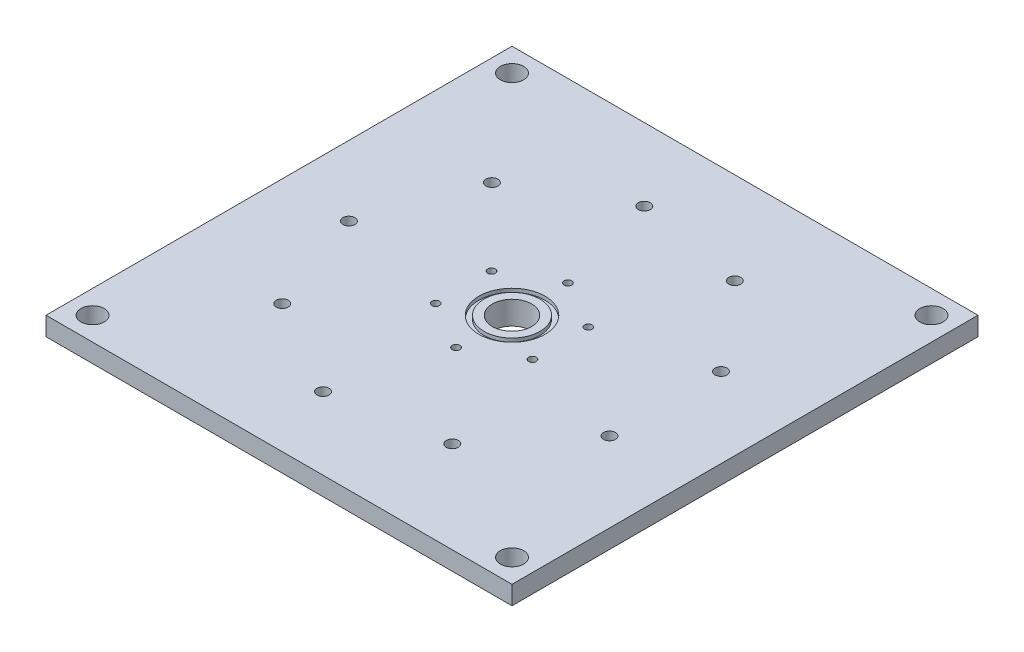
ISO-10303-21;
HEADER;
FILE_DESCRIPTION(('STEP AP214'),'2;1');
FILE_NAME('part.step','',(''),(''),'','','');
FILE_SCHEMA(('AUTOMOTIVE_DESIGN { 1 0 10303 214 1 1 1 1 }'));
ENDSEC;
DATA;
#1=APPLICATION_CONTEXT('core data for automotive mechanical design processes');
#2=APPLICATION_PROTOCOL_DEFINITION('international standard','automotive_design',2000,#1);
#3=PRODUCT_CONTEXT('',#1,'mechanical');
#4=PRODUCT('Part','Part','',(#3));
#5=PRODUCT_RELATED_PRODUCT_CATEGORY('part','',(#4));
#6=PRODUCT_DEFINITION_FORMATION('','',#4);
#7=PRODUCT_DEFINITION_CONTEXT('part definition',#1,'design');
#8=PRODUCT_DEFINITION('design','',#6,#7);
#9=PRODUCT_DEFINITION_SHAPE('','',#8);
#10=(LENGTH_UNIT() NAMED_UNIT(*) SI_UNIT(.MILLI.,.METRE.));
#11=(NAMED_UNIT(*) PLANE_ANGLE_UNIT() SI_UNIT($,.RADIAN.));
#12=(NAMED_UNIT(*) SI_UNIT($,.STERADIAN.) SOLID_ANGLE_UNIT());
#13=UNCERTAINTY_MEASURE_WITH_UNIT(LENGTH_MEASURE(1.E-05),#10,'distance_accuracy_value','');
#14=(GEOMETRIC_REPRESENTATION_CONTEXT(3) GLOBAL_UNCERTAINTY_ASSIGNED_CONTEXT((#13)) GLOBAL_UNIT_ASSIGNED_CONTEXT((#10,
#11,#12)) REPRESENTATION_CONTEXT('',''));
#15=CARTESIAN_POINT('',(0.,0.,0.));
#16=DIRECTION('',(0.,0.,1.));
#17=DIRECTION('',(1.,0.,0.));
#18=AXIS2_PLACEMENT_3D('',#15,#16,#17);
#19=CARTESIAN_POINT('',(0.,0.,0.));
#20=DIRECTION('',(0.,-1.,0.));
#21=DIRECTION('',(0.,0.,-1.));
#22=AXIS2_PLACEMENT_3D('',#19,#20,#21);
#23=PLANE('',#22);
#24=DIRECTION('',(0.,0.,-1.));
#25=VECTOR('',#24,1.);
#26=CARTESIAN_POINT('',(63.5,0.,63.5));
#27=LINE('',#26,#25);
#28=CARTESIAN_POINT('',(63.5,0.,63.5));
#29=VERTEX_POINT('',#28);
#30=CARTESIAN_POINT('',(63.5,0.,-63.5));
#31=VERTEX_POINT('',#30);
#32=EDGE_CURVE('E108',#29,#31,#27,.T.);
#33=ORIENTED_EDGE('',*,*,#32,.F.);
#34=DIRECTION('',(1.,0.,0.));
#35=VECTOR('',#34,1.);
#36=CARTESIAN_POINT('',(-63.5,0.,63.5));
#37=LINE('',#36,#35);
#38=CARTESIAN_POINT('',(-63.5,0.,63.5));
#39=VERTEX_POINT('',#38);
#40=EDGE_CURVE('E84',#39,#29,#37,.T.);
#41=ORIENTED_EDGE('',*,*,#40,.F.);
#42=DIRECTION('',(0.,0.,1.));
#43=VECTOR('',#42,1.);
#44=CARTESIAN_POINT('',(-63.5,0.,63.5));
#45=LINE('',#44,#43);
#46=CARTESIAN_POINT('',(-63.5,0.,-63.5));
#47=VERTEX_POINT('',#46);
#48=EDGE_CURVE('E78',#47,#39,#45,.T.);
#49=ORIENTED_EDGE('',*,*,#48,.F.);
#50=DIRECTION('',(-1.,0.,0.));
#51=VECTOR('',#50,1.);
#52=CARTESIAN_POINT('',(-63.5,0.,-63.5));
#53=LINE('',#52,#51);
#54=EDGE_CURVE('E100',#31,#47,#53,.T.);
#55=ORIENTED_EDGE('',*,*,#54,.F.);
#56=EDGE_LOOP('',(#33,#41,#49,#55));
#57=FACE_BOUND('',#56,.T.);
#58=CARTESIAN_POINT('',(22.225,0.,38.4948291982183));
#59=DIRECTION('',(0.,-1.,0.));
#60=DIRECTION('',(0.,0.,-1.));
#61=AXIS2_PLACEMENT_3D('',#58,#59,#60);
#62=CIRCLE('',#61,1.63195);
#63=CARTESIAN_POINT('',(22.225,0.,36.8628791982183));
#64=VERTEX_POINT('',#63);
#65=EDGE_CURVE('E173',#64,#64,#62,.F.);
#66=ORIENTED_EDGE('',*,*,#65,.T.);
#67=EDGE_LOOP('',(#66));
#68=FACE_BOUND('',#67,.T.);
#69=CARTESIAN_POINT('',(41.7693369939337,0.,15.2027953708259));
#70=DIRECTION('',(0.,-1.,0.));
#71=DIRECTION('',(0.,0.,-1.));
#72=AXIS2_PLACEMENT_3D('',#69,#70,#71);
#73=CIRCLE('',#72,1.63195);
#74=CARTESIAN_POINT('',(41.7693369939337,0.,13.5708453708259));
#75=VERTEX_POINT('',#74);
#76=EDGE_CURVE('E179',#75,#75,#73,.F.);
#77=ORIENTED_EDGE('',*,*,#76,.T.);
#78=EDGE_LOOP('',(#77));
#79=FACE_BOUND('',#78,.T.);
#80=CARTESIAN_POINT('',(41.7693369939336,0.,-15.2027953708261));
#81=DIRECTION('',(0.,-1.,0.));
#82=DIRECTION('',(0.,0.,-1.));
#83=AXIS2_PLACEMENT_3D('',#80,#81,#82);
#84=CIRCLE('',#83,1.63195);
#85=CARTESIAN_POINT('',(41.7693369939336,0.,-16.8347453708261));
#86=VERTEX_POINT('',#85);
#87=EDGE_CURVE('E185',#86,#86,#84,.F.);
#88=ORIENTED_EDGE('',*,*,#87,.T.);
#89=EDGE_LOOP('',(#88));
#90=FACE_BOUND('',#89,.T.);
#91=CARTESIAN_POINT('',(22.2249999999998,0.,-38.4948291982184));
#92=DIRECTION('',(0.,-1.,0.));
#93=DIRECTION('',(0.,0.,-1.));
#94=AXIS2_PLACEMENT_3D('',#91,#92,#93);
#95=CIRCLE('',#94,1.63195);
#96=CARTESIAN_POINT('',(22.2249999999998,0.,-40.1267791982184));
#97=VERTEX_POINT('',#96);
#98=EDGE_CURVE('E191',#97,#97,#95,.F.);
#99=ORIENTED_EDGE('',*,*,#98,.T.);
#100=EDGE_LOOP('',(#99));
#101=FACE_BOUND('',#100,.T.);
#102=CARTESIAN_POINT('',(-7.71866149729532,0.,-43.7747046213926));
#103=DIRECTION('',(0.,-1.,0.));
#104=DIRECTION('',(0.,0.,-1.));
#105=AXIS2_PLACEMENT_3D('',#102,#103,#104);
#106=CIRCLE('',#105,1.63195);
#107=CARTESIAN_POINT('',(-7.71866149729532,0.,-45.4066546213926));
#108=VERTEX_POINT('',#107);
#109=EDGE_CURVE('E197',#108,#108,#106,.F.);
#110=ORIENTED_EDGE('',*,*,#109,.T.);
#111=EDGE_LOOP('',(#110));
#112=FACE_BOUND('',#111,.T.);
#113=CARTESIAN_POINT('',(-34.0506754966388,0.,-28.5719092505664));
#114=DIRECTION('',(0.,-1.,0.));
#115=DIRECTION('',(0.,0.,-1.));
#116=AXIS2_PLACEMENT_3D('',#113,#114,#115);
#117=CIRCLE('',#116,1.63195);
#118=CARTESIAN_POINT('',(-34.0506754966388,0.,-30.2038592505664));
#119=VERTEX_POINT('',#118);
#120=EDGE_CURVE('E203',#119,#119,#117,.F.);
#121=ORIENTED_EDGE('',*,*,#120,.T.);
#122=EDGE_LOOP('',(#121));
#123=FACE_BOUND('',#122,.T.);
#124=CARTESIAN_POINT('',(-44.45,0.,4.1286418728248E-13));
#125=DIRECTION('',(0.,-1.,0.));
#126=DIRECTION('',(0.,0.,-1.));
#127=AXIS2_PLACEMENT_3D('',#124,#125,#126);
#128=CIRCLE('',#127,1.63195);
#129=CARTESIAN_POINT('',(-44.45,0.,-1.63194999999959));
#130=VERTEX_POINT('',#129);
#131=EDGE_CURVE('E209',#130,#130,#128,.F.);
#132=ORIENTED_EDGE('',*,*,#131,.T.);
#133=EDGE_LOOP('',(#132));
#134=FACE_BOUND('',#133,.T.);
#135=CARTESIAN_POINT('',(-34.0506754966383,0.,28.571909250567));
#136=DIRECTION('',(0.,-1.,0.));
#137=DIRECTION('',(0.,0.,-1.));
#138=AXIS2_PLACEMENT_3D('',#135,#136,#137);
#139=CIRCLE('',#138,1.63195);
#140=CARTESIAN_POINT('',(-34.0506754966383,0.,26.939959250567));
#141=VERTEX_POINT('',#140);
#142=EDGE_CURVE('E215',#141,#141,#139,.F.);
#143=ORIENTED_EDGE('',*,*,#142,.T.);
#144=EDGE_LOOP('',(#143));
#145=FACE_BOUND('',#144,.T.);
#146=CARTESIAN_POINT('',(-7.71866149729452,0.,43.7747046213927));
#147=DIRECTION('',(0.,-1.,0.));
#148=DIRECTION('',(0.,0.,-1.));
#149=AXIS2_PLACEMENT_3D('',#146,#147,#148);
#150=CIRCLE('',#149,1.63195);
#151=CARTESIAN_POINT('',(-7.71866149729452,0.,42.1427546213927));
#152=VERTEX_POINT('',#151);
#153=EDGE_CURVE('E221',#152,#152,#150,.F.);
#154=ORIENTED_EDGE('',*,*,#153,.T.);
#155=EDGE_LOOP('',(#154));
#156=FACE_BOUND('',#155,.T.);
#157=CARTESIAN_POINT('',(57.15,0.,-57.15));
#158=DIRECTION('',(0.,-1.,0.));
#159=DIRECTION('',(0.,0.,-1.));
#160=AXIS2_PLACEMENT_3D('',#157,#158,#159);
#161=CIRCLE('',#160,3.175);
#162=CARTESIAN_POINT('',(57.15,0.,-60.325));
#163=VERTEX_POINT('',#162);
#164=EDGE_CURVE('E227',#163,#163,#161,.F.);
#165=ORIENTED_EDGE('',*,*,#164,.T.);
#166=EDGE_LOOP('',(#165));
#167=FACE_BOUND('',#166,.T.);
#168=CARTESIAN_POINT('',(57.15,0.,57.15));
#169=DIRECTION('',(0.,-1.,0.));
#170=DIRECTION('',(0.,0.,-1.));
#171=AXIS2_PLACEMENT_3D('',#168,#169,#170);
#172=CIRCLE('',#171,3.175);
#173=CARTESIAN_POINT('',(57.15,0.,53.975));
#174=VERTEX_POINT('',#173);
#175=EDGE_CURVE('E233',#174,#174,#172,.F.);
#176=ORIENTED_EDGE('',*,*,#175,.T.);
#177=EDGE_LOOP('',(#176));
#178=FACE_BOUND('',#177,.T.);
#179=CARTESIAN_POINT('',(-57.15,0.,57.15));
#180=DIRECTION('',(0.,-1.,0.));
#181=DIRECTION('',(0.,0.,-1.));
#182=AXIS2_PLACEMENT_3D('',#179,#180,#181);
#183=CIRCLE('',#182,3.175);
#184=CARTESIAN_POINT('',(-57.15,0.,53.975));
#185=VERTEX_POINT('',#184);
#186=EDGE_CURVE('E239',#185,#185,#183,.F.);
#187=ORIENTED_EDGE('',*,*,#186,.T.);
#188=EDGE_LOOP('',(#187));
#189=FACE_BOUND('',#188,.T.);
#190=CARTESIAN_POINT('',(-57.15,0.,-57.15));
#191=DIRECTION('',(0.,-1.,0.));
#192=DIRECTION('',(0.,0.,-1.));
#193=AXIS2_PLACEMENT_3D('',#190,#191,#192);
#194=CIRCLE('',#193,3.175);
#195=CARTESIAN_POINT('',(-57.15,0.,-60.325));
#196=VERTEX_POINT('',#195);
#197=EDGE_CURVE('E245',#196,#196,#194,.F.);
#198=ORIENTED_EDGE('',*,*,#197,.T.);
#199=EDGE_LOOP('',(#198));
#200=FACE_BOUND('',#199,.T.);
#201=CARTESIAN_POINT('',(0.,0.,0.));
#202=DIRECTION('',(0.,-1.,0.));
#203=DIRECTION('',(0.,0.,-1.));
#204=AXIS2_PLACEMENT_3D('',#201,#202,#203);
#205=CIRCLE('',#204,10.9855);
#206=CARTESIAN_POINT('',(0.,0.,-10.9855));
#207=VERTEX_POINT('',#206);
#208=EDGE_CURVE('E251',#207,#207,#205,.T.);
#209=ORIENTED_EDGE('',*,*,#208,.F.);
#210=EDGE_LOOP('',(#209));
#211=FACE_BOUND('',#210,.T.);
#212=ADVANCED_FACE('F44',(#57,#68,#79,#90,#101,#112,#123,#134,#145,#156,#167,#178,#189,#200,
#211),#23,.T.);
#213=CARTESIAN_POINT('',(0.,5.08,0.));
#214=DIRECTION('',(0.,-1.,0.));
#215=DIRECTION('',(0.,0.,-1.));
#216=AXIS2_PLACEMENT_3D('',#213,#214,#215);
#217=PLANE('',#216);
#218=CARTESIAN_POINT('',(0.,5.08,0.));
#219=DIRECTION('',(0.,1.,0.));
#220=DIRECTION('',(0.,0.,1.));
#221=AXIS2_PLACEMENT_3D('',#218,#219,#220);
#222=CIRCLE('',#221,5.3467);
#223=CARTESIAN_POINT('',(0.,5.08,5.3467));
#224=VERTEX_POINT('',#223);
#225=EDGE_CURVE('E111',#224,#224,#222,.T.);
#226=ORIENTED_EDGE('',*,*,#225,.F.);
#227=EDGE_LOOP('',(#226));
#228=FACE_BOUND('',#227,.T.);
#229=CARTESIAN_POINT('',(0.,5.08,0.));
#230=DIRECTION('',(0.,1.,0.));
#231=DIRECTION('',(0.,0.,1.));
#232=AXIS2_PLACEMENT_3D('',#229,#230,#231);
#233=CIRCLE('',#232,7.62);
#234=CARTESIAN_POINT('',(0.,5.08,7.62));
#235=VERTEX_POINT('',#234);
#236=EDGE_CURVE('E131',#235,#235,#233,.T.);
#237=ORIENTED_EDGE('',*,*,#236,.T.);
#238=EDGE_LOOP('',(#237));
#239=FACE_BOUND('',#238,.T.);
#240=ADVANCED_FACE('F278',(#228,#239),#217,.F.);
#241=CARTESIAN_POINT('',(63.5,5.08,63.5));
#242=DIRECTION('',(-1.,0.,0.));
#243=DIRECTION('',(0.,0.,1.));
#244=AXIS2_PLACEMENT_3D('',#241,#242,#243);
#245=PLANE('',#244);
#246=ORIENTED_EDGE('',*,*,#32,.T.);
#247=DIRECTION('',(0.,-1.,0.));
#248=VECTOR('',#247,1.);
#249=CARTESIAN_POINT('',(63.5,5.08,-63.5));
#250=LINE('',#249,#248);
#251=CARTESIAN_POINT('',(63.5,5.08,-63.5));
#252=VERTEX_POINT('',#251);
#253=EDGE_CURVE('E13',#252,#31,#250,.T.);
#254=ORIENTED_EDGE('',*,*,#253,.F.);
#255=DIRECTION('',(0.,0.,-1.));
#256=VECTOR('',#255,1.);
#257=CARTESIAN_POINT('',(63.5,5.08,63.5));
#258=LINE('',#257,#256);
#259=CARTESIAN_POINT('',(63.5,5.08,63.5));
#260=VERTEX_POINT('',#259);
#261=EDGE_CURVE('E96',#260,#252,#258,.T.);
#262=ORIENTED_EDGE('',*,*,#261,.F.);
#263=DIRECTION('',(0.,-1.,0.));
#264=VECTOR('',#263,1.);
#265=CARTESIAN_POINT('',(63.5,5.08,63.5));
#266=LINE('',#265,#264);
#267=EDGE_CURVE('E104',#260,#29,#266,.T.);
#268=ORIENTED_EDGE('',*,*,#267,.T.);
#269=EDGE_LOOP('',(#246,#254,#262,#268));
#270=FACE_BOUND('',#269,.T.);
#271=ADVANCED_FACE('F46',(#270),#245,.F.);
#272=CARTESIAN_POINT('',(-63.5,5.08,-63.5));
#273=DIRECTION('',(0.,0.,1.));
#274=DIRECTION('',(1.,0.,0.));
#275=AXIS2_PLACEMENT_3D('',#272,#273,#274);
#276=PLANE('',#275);
#277=ORIENTED_EDGE('',*,*,#54,.T.);
#278=DIRECTION('',(0.,-1.,0.));
#279=VECTOR('',#278,1.);
#280=CARTESIAN_POINT('',(-63.5,5.08,-63.5));
#281=LINE('',#280,#279);
#282=CARTESIAN_POINT('',(-63.5,5.08,-63.5));
#283=VERTEX_POINT('',#282);
#284=EDGE_CURVE('E53',#283,#47,#281,.T.);
#285=ORIENTED_EDGE('',*,*,#284,.F.);
#286=DIRECTION('',(-1.,0.,0.));
#287=VECTOR('',#286,1.);
#288=CARTESIAN_POINT('',(-63.5,5.08,-63.5));
#289=LINE('',#288,#287);
#290=EDGE_CURVE('E91',#252,#283,#289,.T.);
#291=ORIENTED_EDGE('',*,*,#290,.F.);
#292=ORIENTED_EDGE('',*,*,#253,.T.);
#293=EDGE_LOOP('',(#277,#285,#291,#292));
#294=FACE_BOUND('',#293,.T.);
#295=ADVANCED_FACE('F99',(#294),#276,.F.);
#296=CARTESIAN_POINT('',(-63.5,5.08,63.5));
#297=DIRECTION('',(1.,0.,0.));
#298=DIRECTION('',(0.,0.,-1.));
#299=AXIS2_PLACEMENT_3D('',#296,#297,#298);
#300=PLANE('',#299);
#301=ORIENTED_EDGE('',*,*,#48,.T.);
#302=DIRECTION('',(0.,-1.,0.));
#303=VECTOR('',#302,1.);
#304=CARTESIAN_POINT('',(-63.5,5.08,63.5));
#305=LINE('',#304,#303);
#306=CARTESIAN_POINT('',(-63.5,5.08,63.5));
#307=VERTEX_POINT('',#306);
#308=EDGE_CURVE('E101',#307,#39,#305,.T.);
#309=ORIENTED_EDGE('',*,*,#308,.F.);
#310=DIRECTION('',(0.,0.,1.));
#311=VECTOR('',#310,1.);
#312=CARTESIAN_POINT('',(-63.5,5.08,63.5));
#313=LINE('',#312,#311);
#314=EDGE_CURVE('E94',#283,#307,#313,.T.);
#315=ORIENTED_EDGE('',*,*,#314,.F.);
#316=ORIENTED_EDGE('',*,*,#284,.T.);
#317=EDGE_LOOP('',(#301,#309,#315,#316));
#318=FACE_BOUND('',#317,.T.);
#319=ADVANCED_FACE('F102',(#318),#300,.F.);
#320=CARTESIAN_POINT('',(-63.5,5.08,63.5));
#321=DIRECTION('',(0.,0.,-1.));
#322=DIRECTION('',(-1.,0.,0.));
#323=AXIS2_PLACEMENT_3D('',#320,#321,#322);
#324=PLANE('',#323);
#325=ORIENTED_EDGE('',*,*,#40,.T.);
#326=ORIENTED_EDGE('',*,*,#267,.F.);
#327=DIRECTION('',(1.,0.,0.));
#328=VECTOR('',#327,1.);
#329=CARTESIAN_POINT('',(-63.5,5.08,63.5));
#330=LINE('',#329,#328);
#331=EDGE_CURVE('E61',#307,#260,#330,.T.);
#332=ORIENTED_EDGE('',*,*,#331,.F.);
#333=ORIENTED_EDGE('',*,*,#308,.T.);
#334=EDGE_LOOP('',(#325,#326,#332,#333));
#335=FACE_BOUND('',#334,.T.);
#336=ADVANCED_FACE('F116',(#335),#324,.F.);
#337=CARTESIAN_POINT('',(-57.15,5.08,-57.15));
#338=DIRECTION('',(0.,1.,0.));
#339=DIRECTION('',(0.,0.,-1.));
#340=AXIS2_PLACEMENT_3D('',#337,#338,#339);
#341=CIRCLE('',#340,3.175);
#342=CARTESIAN_POINT('',(-57.15,5.08,-60.325));
#343=VERTEX_POINT('',#342);
#344=EDGE_CURVE('E242',#343,#343,#341,.T.);
#345=ORIENTED_EDGE('',*,*,#344,.F.);
#346=EDGE_LOOP('',(#345));
#347=FACE_BOUND('',#346,.T.);
#348=CARTESIAN_POINT('',(-57.15,5.08,57.15));
#349=DIRECTION('',(0.,1.,0.));
#350=DIRECTION('',(0.,0.,1.));
#351=AXIS2_PLACEMENT_3D('',#348,#349,#350);
#352=CIRCLE('',#351,3.175);
#353=CARTESIAN_POINT('',(-57.15,5.08,60.325));
#354=VERTEX_POINT('',#353);
#355=EDGE_CURVE('E236',#354,#354,#352,.T.);
#356=ORIENTED_EDGE('',*,*,#355,.F.);
#357=EDGE_LOOP('',(#356));
#358=FACE_BOUND('',#357,.T.);
#359=CARTESIAN_POINT('',(57.15,5.08,57.15));
#360=DIRECTION('',(0.,1.,0.));
#361=DIRECTION('',(0.,0.,-1.));
#362=AXIS2_PLACEMENT_3D('',#359,#360,#361);
#363=CIRCLE('',#362,3.175);
#364=CARTESIAN_POINT('',(57.15,5.08,53.975));
#365=VERTEX_POINT('',#364);
#366=EDGE_CURVE('E230',#365,#365,#363,.T.);
#367=ORIENTED_EDGE('',*,*,#366,.F.);
#368=EDGE_LOOP('',(#367));
#369=FACE_BOUND('',#368,.T.);
#370=CARTESIAN_POINT('',(57.15,5.08,-57.15));
#371=DIRECTION('',(0.,1.,0.));
#372=DIRECTION('',(0.,0.,1.));
#373=AXIS2_PLACEMENT_3D('',#370,#371,#372);
#374=CIRCLE('',#373,3.175);
#375=CARTESIAN_POINT('',(57.15,5.08,-53.975));
#376=VERTEX_POINT('',#375);
#377=EDGE_CURVE('E224',#376,#376,#374,.T.);
#378=ORIENTED_EDGE('',*,*,#377,.F.);
#379=EDGE_LOOP('',(#378));
#380=FACE_BOUND('',#379,.T.);
#381=CARTESIAN_POINT('',(-7.71866149729452,5.08,43.7747046213927));
#382=DIRECTION('',(0.,1.,0.));
#383=DIRECTION('',(-0.64278760968653,0.,0.766044443118986));
#384=AXIS2_PLACEMENT_3D('',#381,#382,#383);
#385=CIRCLE('',#384,1.63195);
#386=CARTESIAN_POINT('',(-8.76765873692245,5.08,45.0248508503408));
#387=VERTEX_POINT('',#386);
#388=EDGE_CURVE('E218',#387,#387,#385,.T.);
#389=ORIENTED_EDGE('',*,*,#388,.F.);
#390=EDGE_LOOP('',(#389));
#391=FACE_BOUND('',#390,.T.);
#392=CARTESIAN_POINT('',(-34.0506754966383,5.08,28.571909250567));
#393=DIRECTION('',(0.,1.,0.));
#394=DIRECTION('',(-0.984807753012206,0.,0.17364817766694));
#395=AXIS2_PLACEMENT_3D('',#392,#393,#394);
#396=CIRCLE('',#395,1.63195);
#397=CARTESIAN_POINT('',(-35.6578325091665,5.08,28.8552943941106));
#398=VERTEX_POINT('',#397);
#399=EDGE_CURVE('E212',#398,#398,#396,.T.);
#400=ORIENTED_EDGE('',*,*,#399,.F.);
#401=EDGE_LOOP('',(#400));
#402=FACE_BOUND('',#401,.T.);
#403=CARTESIAN_POINT('',(-44.45,5.08,4.1286418728248E-13));
#404=DIRECTION('',(0.,1.,0.));
#405=DIRECTION('',(-0.866025403784443,0.,-0.499999999999992));
#406=AXIS2_PLACEMENT_3D('',#403,#404,#405);
#407=CIRCLE('',#406,1.63195);
#408=CARTESIAN_POINT('',(-45.863310157706,5.08,-0.815974999999576));
#409=VERTEX_POINT('',#408);
#410=EDGE_CURVE('E206',#409,#409,#407,.T.);
#411=ORIENTED_EDGE('',*,*,#410,.F.);
#412=EDGE_LOOP('',(#411));
#413=FACE_BOUND('',#412,.T.);
#414=CARTESIAN_POINT('',(-34.0506754966388,5.08,-28.5719092505664));
#415=DIRECTION('',(0.,1.,0.));
#416=DIRECTION('',(-0.342020143325676,0.,-0.939692620785906));
#417=AXIS2_PLACEMENT_3D('',#414,#415,#416);
#418=CIRCLE('',#417,1.63195);
#419=CARTESIAN_POINT('',(-34.6088352695391,5.08,-30.105440623058));
#420=VERTEX_POINT('',#419);
#421=EDGE_CURVE('E200',#420,#420,#418,.T.);
#422=ORIENTED_EDGE('',*,*,#421,.F.);
#423=EDGE_LOOP('',(#422));
#424=FACE_BOUND('',#423,.T.);
#425=CARTESIAN_POINT('',(-7.71866149729532,5.08,-43.7747046213926));
#426=DIRECTION('',(0.,1.,0.));
#427=DIRECTION('',(0.342020143325663,0.,-0.939692620785911));
#428=AXIS2_PLACEMENT_3D('',#425,#426,#427);
#429=CIRCLE('',#428,1.63195);
#430=CARTESIAN_POINT('',(-7.160501724395,5.08,-45.3082359938842));
#431=VERTEX_POINT('',#430);
#432=EDGE_CURVE('E194',#431,#431,#429,.T.);
#433=ORIENTED_EDGE('',*,*,#432,.F.);
#434=EDGE_LOOP('',(#433));
#435=FACE_BOUND('',#434,.T.);
#436=CARTESIAN_POINT('',(22.2249999999998,5.08,-38.4948291982184));
#437=DIRECTION('',(0.,1.,0.));
#438=DIRECTION('',(0.866025403784436,0.,-0.500000000000004));
#439=AXIS2_PLACEMENT_3D('',#436,#437,#438);
#440=CIRCLE('',#439,1.63195);
#441=CARTESIAN_POINT('',(23.6383101577058,5.08,-39.3108041982184));
#442=VERTEX_POINT('',#441);
#443=EDGE_CURVE('E188',#442,#442,#440,.T.);
#444=ORIENTED_EDGE('',*,*,#443,.F.);
#445=EDGE_LOOP('',(#444));
#446=FACE_BOUND('',#445,.T.);
#447=CARTESIAN_POINT('',(41.7693369939336,5.08,-15.2027953708261));
#448=DIRECTION('',(0.,1.,0.));
#449=DIRECTION('',(0.984807753012209,0.,0.173648177666927));
#450=AXIS2_PLACEMENT_3D('',#447,#448,#449);
#451=CIRCLE('',#450,1.63195);
#452=CARTESIAN_POINT('',(43.3764940064618,5.08,-14.9194102272826));
#453=VERTEX_POINT('',#452);
#454=EDGE_CURVE('E182',#453,#453,#451,.T.);
#455=ORIENTED_EDGE('',*,*,#454,.F.);
#456=EDGE_LOOP('',(#455));
#457=FACE_BOUND('',#456,.T.);
#458=CARTESIAN_POINT('',(41.7693369939337,5.08,15.2027953708259));
#459=DIRECTION('',(0.,1.,0.));
#460=DIRECTION('',(0.642787609686541,0.,0.766044443118977));
#461=AXIS2_PLACEMENT_3D('',#458,#459,#460);
#462=CIRCLE('',#461,1.63195);
#463=CARTESIAN_POINT('',(42.8183342335616,5.08,16.4529415997739));
#464=VERTEX_POINT('',#463);
#465=EDGE_CURVE('E176',#464,#464,#462,.T.);
#466=ORIENTED_EDGE('',*,*,#465,.F.);
#467=EDGE_LOOP('',(#466));
#468=FACE_BOUND('',#467,.T.);
#469=CARTESIAN_POINT('',(22.225,5.08,38.4948291982183));
#470=DIRECTION('',(0.,1.,0.));
#471=DIRECTION('',(0.,0.,1.));
#472=AXIS2_PLACEMENT_3D('',#469,#470,#471);
#473=CIRCLE('',#472,1.63195);
#474=CARTESIAN_POINT('',(22.225,5.08,40.1267791982183));
#475=VERTEX_POINT('',#474);
#476=EDGE_CURVE('E170',#475,#475,#473,.T.);
#477=ORIENTED_EDGE('',*,*,#476,.F.);
#478=EDGE_LOOP('',(#477));
#479=FACE_BOUND('',#478,.T.);
#480=CARTESIAN_POINT('',(-13.1982271536748,5.08,7.62000000000015));
#481=DIRECTION('',(0.,1.,0.));
#482=DIRECTION('',(-0.866025403784433,0.,0.50000000000001));
#483=AXIS2_PLACEMENT_3D('',#480,#481,#482);
#484=CIRCLE('',#483,1.03251);
#485=CARTESIAN_POINT('',(-14.0924070433362,5.08,8.13625500000017));
#486=VERTEX_POINT('',#485);
#487=EDGE_CURVE('E167',#486,#486,#484,.T.);
#488=ORIENTED_EDGE('',*,*,#487,.F.);
#489=EDGE_LOOP('',(#488));
#490=FACE_BOUND('',#489,.T.);
#491=CARTESIAN_POINT('',(-13.1982271536749,5.08,-7.61999999999988));
#492=DIRECTION('',(0.,1.,0.));
#493=DIRECTION('',(-0.866025403784443,0.,-0.499999999999992));
#494=AXIS2_PLACEMENT_3D('',#491,#492,#493);
#495=CIRCLE('',#494,1.03251);
#496=CARTESIAN_POINT('',(-14.0924070433364,5.08,-8.13625499999987));
#497=VERTEX_POINT('',#496);
#498=EDGE_CURVE('E161',#497,#497,#495,.T.);
#499=ORIENTED_EDGE('',*,*,#498,.F.);
#500=EDGE_LOOP('',(#499));
#501=FACE_BOUND('',#500,.T.);
#502=CARTESIAN_POINT('',(0.,5.08,-15.24));
#503=DIRECTION('',(0.,1.,0.));
#504=DIRECTION('',(0.,0.,-1.));
#505=AXIS2_PLACEMENT_3D('',#502,#503,#504);
#506=CIRCLE('',#505,1.03251);
#507=CARTESIAN_POINT('',(0.,5.08,-16.27251));
#508=VERTEX_POINT('',#507);
#509=EDGE_CURVE('E155',#508,#508,#506,.T.);
#510=ORIENTED_EDGE('',*,*,#509,.F.);
#511=EDGE_LOOP('',(#510));
#512=FACE_BOUND('',#511,.T.);
#513=CARTESIAN_POINT('',(13.1982271536748,5.08,-7.62000000000006));
#514=DIRECTION('',(0.,1.,0.));
#515=DIRECTION('',(0.866025403784436,0.,-0.500000000000004));
#516=AXIS2_PLACEMENT_3D('',#513,#514,#515);
#517=CIRCLE('',#516,1.03251);
#518=CARTESIAN_POINT('',(14.0924070433363,5.08,-8.13625500000007));
#519=VERTEX_POINT('',#518);
#520=EDGE_CURVE('E149',#519,#519,#517,.T.);
#521=ORIENTED_EDGE('',*,*,#520,.F.);
#522=EDGE_LOOP('',(#521));
#523=FACE_BOUND('',#522,.T.);
#524=CARTESIAN_POINT('',(13.1982271536749,5.08,7.61999999999997));
#525=DIRECTION('',(0.,1.,0.));
#526=DIRECTION('',(0.86602540378444,0.,0.499999999999998));
#527=AXIS2_PLACEMENT_3D('',#524,#525,#526);
#528=CIRCLE('',#527,1.03251);
#529=CARTESIAN_POINT('',(14.0924070433363,5.08,8.13625499999997));
#530=VERTEX_POINT('',#529);
#531=EDGE_CURVE('E143',#530,#530,#528,.T.);
#532=ORIENTED_EDGE('',*,*,#531,.F.);
#533=EDGE_LOOP('',(#532));
#534=FACE_BOUND('',#533,.T.);
#535=CARTESIAN_POINT('',(0.,5.08,15.24));
#536=DIRECTION('',(0.,1.,0.));
#537=DIRECTION('',(0.,0.,1.));
#538=AXIS2_PLACEMENT_3D('',#535,#536,#537);
#539=CIRCLE('',#538,1.03251);
#540=CARTESIAN_POINT('',(0.,5.08,16.27251));
#541=VERTEX_POINT('',#540);
#542=EDGE_CURVE('E137',#541,#541,#539,.T.);
#543=ORIENTED_EDGE('',*,*,#542,.F.);
#544=EDGE_LOOP('',(#543));
#545=FACE_BOUND('',#544,.T.);
#546=CARTESIAN_POINT('',(0.,5.08,0.));
#547=DIRECTION('',(0.,1.,0.));
#548=DIRECTION('',(0.,0.,1.));
#549=AXIS2_PLACEMENT_3D('',#546,#547,#548);
#550=CIRCLE('',#549,9.017);
#551=CARTESIAN_POINT('',(0.,5.08,9.017));
#552=VERTEX_POINT('',#551);
#553=EDGE_CURVE('E125',#552,#552,#550,.T.);
#554=ORIENTED_EDGE('',*,*,#553,.F.);
#555=EDGE_LOOP('',(#554));
#556=FACE_BOUND('',#555,.T.);
#557=ORIENTED_EDGE('',*,*,#261,.T.);
#558=ORIENTED_EDGE('',*,*,#290,.T.);
#559=ORIENTED_EDGE('',*,*,#314,.T.);
#560=ORIENTED_EDGE('',*,*,#331,.T.);
#561=EDGE_LOOP('',(#557,#558,#559,#560));
#562=FACE_BOUND('',#561,.T.);
#563=ADVANCED_FACE('F92',(#347,#358,#369,#380,#391,#402,#413,#424,#435,#446,#457,#468,#479,#490,
#501,#512,#523,#534,#545,#556,#562),#217,.F.);
#564=CARTESIAN_POINT('',(0.,-0.00100000000000013,0.));
#565=DIRECTION('',(0.,1.,0.));
#566=DIRECTION('',(0.,0.,1.));
#567=AXIS2_PLACEMENT_3D('',#564,#565,#566);
#568=CYLINDRICAL_SURFACE('',#567,5.3467);
#569=ORIENTED_EDGE('',*,*,#225,.T.);
#570=EDGE_LOOP('',(#569));
#571=FACE_BOUND('',#570,.T.);
#572=CARTESIAN_POINT('',(0.,-1.27,0.));
#573=DIRECTION('',(0.,-1.,0.));
#574=DIRECTION('',(0.,0.,-1.));
#575=AXIS2_PLACEMENT_3D('',#572,#573,#574);
#576=CIRCLE('',#575,5.3467);
#577=CARTESIAN_POINT('',(0.,-1.27,-5.3467));
#578=VERTEX_POINT('',#577);
#579=EDGE_CURVE('E254',#578,#578,#576,.T.);
#580=ORIENTED_EDGE('',*,*,#579,.T.);
#581=EDGE_LOOP('',(#580));
#582=FACE_BOUND('',#581,.T.);
#583=ADVANCED_FACE('F260',(#571,#582),#568,.F.);
#584=CARTESIAN_POINT('',(0.,4.1021,0.));
#585=DIRECTION('',(0.,1.,0.));
#586=DIRECTION('',(0.,0.,1.));
#587=AXIS2_PLACEMENT_3D('',#584,#585,#586);
#588=CYLINDRICAL_SURFACE('',#587,9.017);
#589=CARTESIAN_POINT('',(0.,4.1021,0.));
#590=DIRECTION('',(0.,1.,0.));
#591=DIRECTION('',(0.,0.,1.));
#592=AXIS2_PLACEMENT_3D('',#589,#590,#591);
#593=CIRCLE('',#592,9.017);
#594=CARTESIAN_POINT('',(0.,4.1021,9.017));
#595=VERTEX_POINT('',#594);
#596=EDGE_CURVE('E124',#595,#595,#593,.T.);
#597=ORIENTED_EDGE('',*,*,#596,.F.);
#598=EDGE_LOOP('',(#597));
#599=FACE_BOUND('',#598,.T.);
#600=ORIENTED_EDGE('',*,*,#553,.T.);
#601=EDGE_LOOP('',(#600));
#602=FACE_BOUND('',#601,.T.);
#603=ADVANCED_FACE('F311',(#599,#602),#588,.F.);
#604=CARTESIAN_POINT('',(0.,4.1021,0.));
#605=DIRECTION('',(0.,1.,0.));
#606=DIRECTION('',(0.,0.,1.));
#607=AXIS2_PLACEMENT_3D('',#604,#605,#606);
#608=PLANE('',#607);
#609=CARTESIAN_POINT('',(0.,4.1021,0.));
#610=DIRECTION('',(0.,1.,0.));
#611=DIRECTION('',(0.,0.,1.));
#612=AXIS2_PLACEMENT_3D('',#609,#610,#611);
#613=CIRCLE('',#612,7.62);
#614=CARTESIAN_POINT('',(0.,4.1021,7.62));
#615=VERTEX_POINT('',#614);
#616=EDGE_CURVE('E128',#615,#615,#613,.T.);
#617=ORIENTED_EDGE('',*,*,#616,.F.);
#618=EDGE_LOOP('',(#617));
#619=FACE_BOUND('',#618,.T.);
#620=ORIENTED_EDGE('',*,*,#596,.T.);
#621=EDGE_LOOP('',(#620));
#622=FACE_BOUND('',#621,.T.);
#623=ADVANCED_FACE('F315',(#619,#622),#608,.T.);
#624=CARTESIAN_POINT('',(0.,4.1021,0.));
#625=DIRECTION('',(0.,1.,0.));
#626=DIRECTION('',(0.,0.,1.));
#627=AXIS2_PLACEMENT_3D('',#624,#625,#626);
#628=CYLINDRICAL_SURFACE('',#627,7.62);
#629=ORIENTED_EDGE('',*,*,#616,.T.);
#630=EDGE_LOOP('',(#629));
#631=FACE_BOUND('',#630,.T.);
#632=ORIENTED_EDGE('',*,*,#236,.F.);
#633=EDGE_LOOP('',(#632));
#634=FACE_BOUND('',#633,.T.);
#635=ADVANCED_FACE('F326',(#631,#634),#628,.T.);
#636=CARTESIAN_POINT('',(0.,1.905,15.24));
#637=DIRECTION('',(0.,1.,0.));
#638=DIRECTION('',(0.,0.,1.));
#639=AXIS2_PLACEMENT_3D('',#636,#637,#638);
#640=CYLINDRICAL_SURFACE('',#639,1.03251);
#641=CARTESIAN_POINT('',(0.,1.905,15.24));
#642=DIRECTION('',(0.,1.,0.));
#643=DIRECTION('',(0.,0.,1.));
#644=AXIS2_PLACEMENT_3D('',#641,#642,#643);
#645=CIRCLE('',#644,1.03251);
#646=CARTESIAN_POINT('',(0.,1.905,16.27251));
#647=VERTEX_POINT('',#646);
#648=EDGE_CURVE('E134',#647,#647,#645,.T.);
#649=ORIENTED_EDGE('',*,*,#648,.F.);
#650=EDGE_LOOP('',(#649));
#651=FACE_BOUND('',#650,.T.);
#652=ORIENTED_EDGE('',*,*,#542,.T.);
#653=EDGE_LOOP('',(#652));
#654=FACE_BOUND('',#653,.T.);
#655=ADVANCED_FACE('F336',(#651,#654),#640,.F.);
#656=CARTESIAN_POINT('',(0.,1.905,15.24));
#657=DIRECTION('',(0.,1.,0.));
#658=DIRECTION('',(0.,0.,1.));
#659=AXIS2_PLACEMENT_3D('',#656,#657,#658);
#660=PLANE('',#659);
#661=ORIENTED_EDGE('',*,*,#648,.T.);
#662=EDGE_LOOP('',(#661));
#663=FACE_BOUND('',#662,.T.);
#664=ADVANCED_FACE('F346',(#663),#660,.T.);
#665=CARTESIAN_POINT('',(13.1982271536749,1.905,7.61999999999997));
#666=DIRECTION('',(0.,1.,0.));
#667=DIRECTION('',(0.,0.,1.));
#668=AXIS2_PLACEMENT_3D('',#665,#666,#667);
#669=CYLINDRICAL_SURFACE('',#668,1.03251);
#670=CARTESIAN_POINT('',(13.1982271536749,1.905,7.61999999999997));
#671=DIRECTION('',(0.,1.,0.));
#672=DIRECTION('',(0.86602540378444,0.,0.499999999999998));
#673=AXIS2_PLACEMENT_3D('',#670,#671,#672);
#674=CIRCLE('',#673,1.03251);
#675=CARTESIAN_POINT('',(14.0924070433363,1.905,8.13625499999997));
#676=VERTEX_POINT('',#675);
#677=EDGE_CURVE('E140',#676,#676,#674,.T.);
#678=ORIENTED_EDGE('',*,*,#677,.F.);
#679=EDGE_LOOP('',(#678));
#680=FACE_BOUND('',#679,.T.);
#681=ORIENTED_EDGE('',*,*,#531,.T.);
#682=EDGE_LOOP('',(#681));
#683=FACE_BOUND('',#682,.T.);
#684=ADVANCED_FACE('F356',(#680,#683),#669,.F.);
#685=CARTESIAN_POINT('',(13.1982271536749,1.905,7.61999999999997));
#686=DIRECTION('',(0.,1.,0.));
#687=DIRECTION('',(0.86602540378444,0.,0.499999999999998));
#688=AXIS2_PLACEMENT_3D('',#685,#686,#687);
#689=PLANE('',#688);
#690=ORIENTED_EDGE('',*,*,#677,.T.);
#691=EDGE_LOOP('',(#690));
#692=FACE_BOUND('',#691,.T.);
#693=ADVANCED_FACE('F366',(#692),#689,.T.);
#694=CARTESIAN_POINT('',(13.1982271536748,1.905,-7.62000000000006));
#695=DIRECTION('',(0.,1.,0.));
#696=DIRECTION('',(0.,0.,1.));
#697=AXIS2_PLACEMENT_3D('',#694,#695,#696);
#698=CYLINDRICAL_SURFACE('',#697,1.03251);
#699=CARTESIAN_POINT('',(13.1982271536748,1.905,-7.62000000000006));
#700=DIRECTION('',(0.,1.,0.));
#701=DIRECTION('',(0.866025403784436,0.,-0.500000000000004));
#702=AXIS2_PLACEMENT_3D('',#699,#700,#701);
#703=CIRCLE('',#702,1.03251);
#704=CARTESIAN_POINT('',(14.0924070433363,1.905,-8.13625500000007));
#705=VERTEX_POINT('',#704);
#706=EDGE_CURVE('E146',#705,#705,#703,.T.);
#707=ORIENTED_EDGE('',*,*,#706,.F.);
#708=EDGE_LOOP('',(#707));
#709=FACE_BOUND('',#708,.T.);
#710=ORIENTED_EDGE('',*,*,#520,.T.);
#711=EDGE_LOOP('',(#710));
#712=FACE_BOUND('',#711,.T.);
#713=ADVANCED_FACE('F376',(#709,#712),#698,.F.);
#714=CARTESIAN_POINT('',(13.1982271536748,1.905,-7.62000000000006));
#715=DIRECTION('',(0.,1.,0.));
#716=DIRECTION('',(0.866025403784436,0.,-0.500000000000004));
#717=AXIS2_PLACEMENT_3D('',#714,#715,#716);
#718=PLANE('',#717);
#719=ORIENTED_EDGE('',*,*,#706,.T.);
#720=EDGE_LOOP('',(#719));
#721=FACE_BOUND('',#720,.T.);
#722=ADVANCED_FACE('F386',(#721),#718,.T.);
#723=CARTESIAN_POINT('',(0.,1.905,-15.24));
#724=DIRECTION('',(0.,1.,0.));
#725=DIRECTION('',(0.,0.,1.));
#726=AXIS2_PLACEMENT_3D('',#723,#724,#725);
#727=CYLINDRICAL_SURFACE('',#726,1.03251);
#728=CARTESIAN_POINT('',(0.,1.905,-15.24));
#729=DIRECTION('',(0.,1.,0.));
#730=DIRECTION('',(0.,0.,-1.));
#731=AXIS2_PLACEMENT_3D('',#728,#729,#730);
#732=CIRCLE('',#731,1.03251);
#733=CARTESIAN_POINT('',(0.,1.905,-16.27251));
#734=VERTEX_POINT('',#733);
#735=EDGE_CURVE('E152',#734,#734,#732,.T.);
#736=ORIENTED_EDGE('',*,*,#735,.F.);
#737=EDGE_LOOP('',(#736));
#738=FACE_BOUND('',#737,.T.);
#739=ORIENTED_EDGE('',*,*,#509,.T.);
#740=EDGE_LOOP('',(#739));
#741=FACE_BOUND('',#740,.T.);
#742=ADVANCED_FACE('F396',(#738,#741),#727,.F.);
#743=CARTESIAN_POINT('',(0.,1.905,-15.24));
#744=DIRECTION('',(0.,1.,0.));
#745=DIRECTION('',(0.,0.,-1.));
#746=AXIS2_PLACEMENT_3D('',#743,#744,#745);
#747=PLANE('',#746);
#748=ORIENTED_EDGE('',*,*,#735,.T.);
#749=EDGE_LOOP('',(#748));
#750=FACE_BOUND('',#749,.T.);
#751=ADVANCED_FACE('F406',(#750),#747,.T.);
#752=CARTESIAN_POINT('',(-13.1982271536749,1.905,-7.61999999999988));
#753=DIRECTION('',(0.,1.,0.));
#754=DIRECTION('',(0.,0.,1.));
#755=AXIS2_PLACEMENT_3D('',#752,#753,#754);
#756=CYLINDRICAL_SURFACE('',#755,1.03251);
#757=CARTESIAN_POINT('',(-13.1982271536749,1.905,-7.61999999999988));
#758=DIRECTION('',(0.,1.,0.));
#759=DIRECTION('',(-0.866025403784443,0.,-0.499999999999992));
#760=AXIS2_PLACEMENT_3D('',#757,#758,#759);
#761=CIRCLE('',#760,1.03251);
#762=CARTESIAN_POINT('',(-14.0924070433364,1.905,-8.13625499999987));
#763=VERTEX_POINT('',#762);
#764=EDGE_CURVE('E158',#763,#763,#761,.T.);
#765=ORIENTED_EDGE('',*,*,#764,.F.);
#766=EDGE_LOOP('',(#765));
#767=FACE_BOUND('',#766,.T.);
#768=ORIENTED_EDGE('',*,*,#498,.T.);
#769=EDGE_LOOP('',(#768));
#770=FACE_BOUND('',#769,.T.);
#771=ADVANCED_FACE('F416',(#767,#770),#756,.F.);
#772=CARTESIAN_POINT('',(-13.1982271536749,1.905,-7.61999999999988));
#773=DIRECTION('',(0.,1.,0.));
#774=DIRECTION('',(-0.866025403784443,0.,-0.499999999999992));
#775=AXIS2_PLACEMENT_3D('',#772,#773,#774);
#776=PLANE('',#775);
#777=ORIENTED_EDGE('',*,*,#764,.T.);
#778=EDGE_LOOP('',(#777));
#779=FACE_BOUND('',#778,.T.);
#780=ADVANCED_FACE('F426',(#779),#776,.T.);
#781=CARTESIAN_POINT('',(-13.1982271536748,1.905,7.62000000000015));
#782=DIRECTION('',(0.,1.,0.));
#783=DIRECTION('',(0.,0.,1.));
#784=AXIS2_PLACEMENT_3D('',#781,#782,#783);
#785=CYLINDRICAL_SURFACE('',#784,1.03251);
#786=CARTESIAN_POINT('',(-13.1982271536748,1.905,7.62000000000015));
#787=DIRECTION('',(0.,1.,0.));
#788=DIRECTION('',(-0.866025403784433,0.,0.50000000000001));
#789=AXIS2_PLACEMENT_3D('',#786,#787,#788);
#790=CIRCLE('',#789,1.03251);
#791=CARTESIAN_POINT('',(-14.0924070433362,1.905,8.13625500000017));
#792=VERTEX_POINT('',#791);
#793=EDGE_CURVE('E164',#792,#792,#790,.T.);
#794=ORIENTED_EDGE('',*,*,#793,.F.);
#795=EDGE_LOOP('',(#794));
#796=FACE_BOUND('',#795,.T.);
#797=ORIENTED_EDGE('',*,*,#487,.T.);
#798=EDGE_LOOP('',(#797));
#799=FACE_BOUND('',#798,.T.);
#800=ADVANCED_FACE('F436',(#796,#799),#785,.F.);
#801=CARTESIAN_POINT('',(-13.1982271536748,1.905,7.62000000000015));
#802=DIRECTION('',(0.,1.,0.));
#803=DIRECTION('',(-0.866025403784433,0.,0.50000000000001));
#804=AXIS2_PLACEMENT_3D('',#801,#802,#803);
#805=PLANE('',#804);
#806=ORIENTED_EDGE('',*,*,#793,.T.);
#807=EDGE_LOOP('',(#806));
#808=FACE_BOUND('',#807,.T.);
#809=ADVANCED_FACE('F446',(#808),#805,.T.);
#810=CARTESIAN_POINT('',(22.225,-0.00100000000000013,38.4948291982183));
#811=DIRECTION('',(0.,1.,0.));
#812=DIRECTION('',(0.,0.,1.));
#813=AXIS2_PLACEMENT_3D('',#810,#811,#812);
#814=CYLINDRICAL_SURFACE('',#813,1.63195);
#815=ORIENTED_EDGE('',*,*,#65,.F.);
#816=EDGE_LOOP('',(#815));
#817=FACE_BOUND('',#816,.T.);
#818=ORIENTED_EDGE('',*,*,#476,.T.);
#819=EDGE_LOOP('',(#818));
#820=FACE_BOUND('',#819,.T.);
#821=ADVANCED_FACE('F456',(#817,#820),#814,.F.);
#822=CARTESIAN_POINT('',(41.7693369939337,-0.00100000000000013,15.2027953708259));
#823=DIRECTION('',(0.,1.,0.));
#824=DIRECTION('',(0.,0.,1.));
#825=AXIS2_PLACEMENT_3D('',#822,#823,#824);
#826=CYLINDRICAL_SURFACE('',#825,1.63195);
#827=ORIENTED_EDGE('',*,*,#76,.F.);
#828=EDGE_LOOP('',(#827));
#829=FACE_BOUND('',#828,.T.);
#830=ORIENTED_EDGE('',*,*,#465,.T.);
#831=EDGE_LOOP('',(#830));
#832=FACE_BOUND('',#831,.T.);
#833=ADVANCED_FACE('F466',(#829,#832),#826,.F.);
#834=CARTESIAN_POINT('',(41.7693369939336,-0.00100000000000013,-15.2027953708261));
#835=DIRECTION('',(0.,1.,0.));
#836=DIRECTION('',(0.,0.,1.));
#837=AXIS2_PLACEMENT_3D('',#834,#835,#836);
#838=CYLINDRICAL_SURFACE('',#837,1.63195);
#839=ORIENTED_EDGE('',*,*,#87,.F.);
#840=EDGE_LOOP('',(#839));
#841=FACE_BOUND('',#840,.T.);
#842=ORIENTED_EDGE('',*,*,#454,.T.);
#843=EDGE_LOOP('',(#842));
#844=FACE_BOUND('',#843,.T.);
#845=ADVANCED_FACE('F476',(#841,#844),#838,.F.);
#846=CARTESIAN_POINT('',(22.2249999999998,-0.00100000000000013,-38.4948291982184));
#847=DIRECTION('',(0.,1.,0.));
#848=DIRECTION('',(0.,0.,1.));
#849=AXIS2_PLACEMENT_3D('',#846,#847,#848);
#850=CYLINDRICAL_SURFACE('',#849,1.63195);
#851=ORIENTED_EDGE('',*,*,#98,.F.);
#852=EDGE_LOOP('',(#851));
#853=FACE_BOUND('',#852,.T.);
#854=ORIENTED_EDGE('',*,*,#443,.T.);
#855=EDGE_LOOP('',(#854));
#856=FACE_BOUND('',#855,.T.);
#857=ADVANCED_FACE('F486',(#853,#856),#850,.F.);
#858=CARTESIAN_POINT('',(-7.71866149729532,-0.00100000000000013,-43.7747046213926));
#859=DIRECTION('',(0.,1.,0.));
#860=DIRECTION('',(0.,0.,1.));
#861=AXIS2_PLACEMENT_3D('',#858,#859,#860);
#862=CYLINDRICAL_SURFACE('',#861,1.63195);
#863=ORIENTED_EDGE('',*,*,#109,.F.);
#864=EDGE_LOOP('',(#863));
#865=FACE_BOUND('',#864,.T.);
#866=ORIENTED_EDGE('',*,*,#432,.T.);
#867=EDGE_LOOP('',(#866));
#868=FACE_BOUND('',#867,.T.);
#869=ADVANCED_FACE('F496',(#865,#868),#862,.F.);
#870=CARTESIAN_POINT('',(-34.0506754966388,-0.00100000000000013,-28.5719092505664));
#871=DIRECTION('',(0.,1.,0.));
#872=DIRECTION('',(0.,0.,1.));
#873=AXIS2_PLACEMENT_3D('',#870,#871,#872);
#874=CYLINDRICAL_SURFACE('',#873,1.63195);
#875=ORIENTED_EDGE('',*,*,#120,.F.);
#876=EDGE_LOOP('',(#875));
#877=FACE_BOUND('',#876,.T.);
#878=ORIENTED_EDGE('',*,*,#421,.T.);
#879=EDGE_LOOP('',(#878));
#880=FACE_BOUND('',#879,.T.);
#881=ADVANCED_FACE('F506',(#877,#880),#874,.F.);
#882=CARTESIAN_POINT('',(-44.45,-0.00100000000000013,4.1286418728248E-13));
#883=DIRECTION('',(0.,1.,0.));
#884=DIRECTION('',(0.,0.,1.));
#885=AXIS2_PLACEMENT_3D('',#882,#883,#884);
#886=CYLINDRICAL_SURFACE('',#885,1.63195);
#887=ORIENTED_EDGE('',*,*,#131,.F.);
#888=EDGE_LOOP('',(#887));
#889=FACE_BOUND('',#888,.T.);
#890=ORIENTED_EDGE('',*,*,#410,.T.);
#891=EDGE_LOOP('',(#890));
#892=FACE_BOUND('',#891,.T.);
#893=ADVANCED_FACE('F516',(#889,#892),#886,.F.);
#894=CARTESIAN_POINT('',(-34.0506754966383,-0.00100000000000013,28.571909250567));
#895=DIRECTION('',(0.,1.,0.));
#896=DIRECTION('',(0.,0.,1.));
#897=AXIS2_PLACEMENT_3D('',#894,#895,#896);
#898=CYLINDRICAL_SURFACE('',#897,1.63195);
#899=ORIENTED_EDGE('',*,*,#142,.F.);
#900=EDGE_LOOP('',(#899));
#901=FACE_BOUND('',#900,.T.);
#902=ORIENTED_EDGE('',*,*,#399,.T.);
#903=EDGE_LOOP('',(#902));
#904=FACE_BOUND('',#903,.T.);
#905=ADVANCED_FACE('F526',(#901,#904),#898,.F.);
#906=CARTESIAN_POINT('',(-7.71866149729452,-0.00100000000000013,43.7747046213927));
#907=DIRECTION('',(0.,1.,0.));
#908=DIRECTION('',(0.,0.,1.));
#909=AXIS2_PLACEMENT_3D('',#906,#907,#908);
#910=CYLINDRICAL_SURFACE('',#909,1.63195);
#911=ORIENTED_EDGE('',*,*,#153,.F.);
#912=EDGE_LOOP('',(#911));
#913=FACE_BOUND('',#912,.T.);
#914=ORIENTED_EDGE('',*,*,#388,.T.);
#915=EDGE_LOOP('',(#914));
#916=FACE_BOUND('',#915,.T.);
#917=ADVANCED_FACE('F536',(#913,#916),#910,.F.);
#918=CARTESIAN_POINT('',(57.15,-0.00100000000000013,-57.15));
#919=DIRECTION('',(0.,1.,0.));
#920=DIRECTION('',(0.,0.,1.));
#921=AXIS2_PLACEMENT_3D('',#918,#919,#920);
#922=CYLINDRICAL_SURFACE('',#921,3.175);
#923=ORIENTED_EDGE('',*,*,#164,.F.);
#924=EDGE_LOOP('',(#923));
#925=FACE_BOUND('',#924,.T.);
#926=ORIENTED_EDGE('',*,*,#377,.T.);
#927=EDGE_LOOP('',(#926));
#928=FACE_BOUND('',#927,.T.);
#929=ADVANCED_FACE('F546',(#925,#928),#922,.F.);
#930=CARTESIAN_POINT('',(57.15,-0.00100000000000013,57.15));
#931=DIRECTION('',(0.,1.,0.));
#932=DIRECTION('',(0.,0.,1.));
#933=AXIS2_PLACEMENT_3D('',#930,#931,#932);
#934=CYLINDRICAL_SURFACE('',#933,3.175);
#935=ORIENTED_EDGE('',*,*,#175,.F.);
#936=EDGE_LOOP('',(#935));
#937=FACE_BOUND('',#936,.T.);
#938=ORIENTED_EDGE('',*,*,#366,.T.);
#939=EDGE_LOOP('',(#938));
#940=FACE_BOUND('',#939,.T.);
#941=ADVANCED_FACE('F564',(#937,#940),#934,.F.);
#942=CARTESIAN_POINT('',(-57.15,-0.00100000000000013,57.15));
#943=DIRECTION('',(0.,1.,0.));
#944=DIRECTION('',(0.,0.,1.));
#945=AXIS2_PLACEMENT_3D('',#942,#943,#944);
#946=CYLINDRICAL_SURFACE('',#945,3.175);
#947=ORIENTED_EDGE('',*,*,#186,.F.);
#948=EDGE_LOOP('',(#947));
#949=FACE_BOUND('',#948,.T.);
#950=ORIENTED_EDGE('',*,*,#355,.T.);
#951=EDGE_LOOP('',(#950));
#952=FACE_BOUND('',#951,.T.);
#953=ADVANCED_FACE('F274',(#949,#952),#946,.F.);
#954=CARTESIAN_POINT('',(-57.15,-0.00100000000000013,-57.15));
#955=DIRECTION('',(0.,1.,0.));
#956=DIRECTION('',(0.,0.,1.));
#957=AXIS2_PLACEMENT_3D('',#954,#955,#956);
#958=CYLINDRICAL_SURFACE('',#957,3.175);
#959=ORIENTED_EDGE('',*,*,#197,.F.);
#960=EDGE_LOOP('',(#959));
#961=FACE_BOUND('',#960,.T.);
#962=ORIENTED_EDGE('',*,*,#344,.T.);
#963=EDGE_LOOP('',(#962));
#964=FACE_BOUND('',#963,.T.);
#965=ADVANCED_FACE('F265',(#961,#964),#958,.F.);
#966=CARTESIAN_POINT('',(0.,-1.27,0.));
#967=DIRECTION('',(0.,-1.,0.));
#968=DIRECTION('',(0.,0.,-1.));
#969=AXIS2_PLACEMENT_3D('',#966,#967,#968);
#970=PLANE('',#969);
#971=CARTESIAN_POINT('',(0.,-1.27,0.));
#972=DIRECTION('',(0.,-1.,0.));
#973=DIRECTION('',(0.,0.,-1.));
#974=AXIS2_PLACEMENT_3D('',#971,#972,#973);
#975=CIRCLE('',#974,10.9855);
#976=CARTESIAN_POINT('',(0.,-1.27,-10.9855));
#977=VERTEX_POINT('',#976);
#978=EDGE_CURVE('E248',#977,#977,#975,.T.);
#979=ORIENTED_EDGE('',*,*,#978,.T.);
#980=EDGE_LOOP('',(#979));
#981=FACE_BOUND('',#980,.T.);
#982=ORIENTED_EDGE('',*,*,#579,.F.);
#983=EDGE_LOOP('',(#982));
#984=FACE_BOUND('',#983,.T.);
#985=ADVANCED_FACE('F262',(#981,#984),#970,.T.);
#986=CARTESIAN_POINT('',(0.,-1.27,0.));
#987=DIRECTION('',(0.,1.,0.));
#988=DIRECTION('',(0.,0.,1.));
#989=AXIS2_PLACEMENT_3D('',#986,#987,#988);
#990=CYLINDRICAL_SURFACE('',#989,10.9855);
#991=ORIENTED_EDGE('',*,*,#978,.F.);
#992=EDGE_LOOP('',(#991));
#993=FACE_BOUND('',#992,.T.);
#994=ORIENTED_EDGE('',*,*,#208,.T.);
#995=EDGE_LOOP('',(#994));
#996=FACE_BOUND('',#995,.T.);
#997=ADVANCED_FACE('F264',(#993,#996),#990,.T.);
#998=CLOSED_SHELL('',(#212,#240,#271,#295,#319,#336,#563,#583,#603,#623,#635,#655,#664,#684,
#693,#713,#722,#742,#751,#771,#780,#800,#809,#821,#833,#845,#857,#869,#881,#893,#905,#917,#929,
#941,#953,#965,#985,#997));
#999=MANIFOLD_SOLID_BREP('B2',#998);
#1000=ADVANCED_BREP_SHAPE_REPRESENTATION('',(#18,#999),#14);
#1001=SHAPE_DEFINITION_REPRESENTATION(#9,#1000);
ENDSEC;
END-ISO-10303-21;
